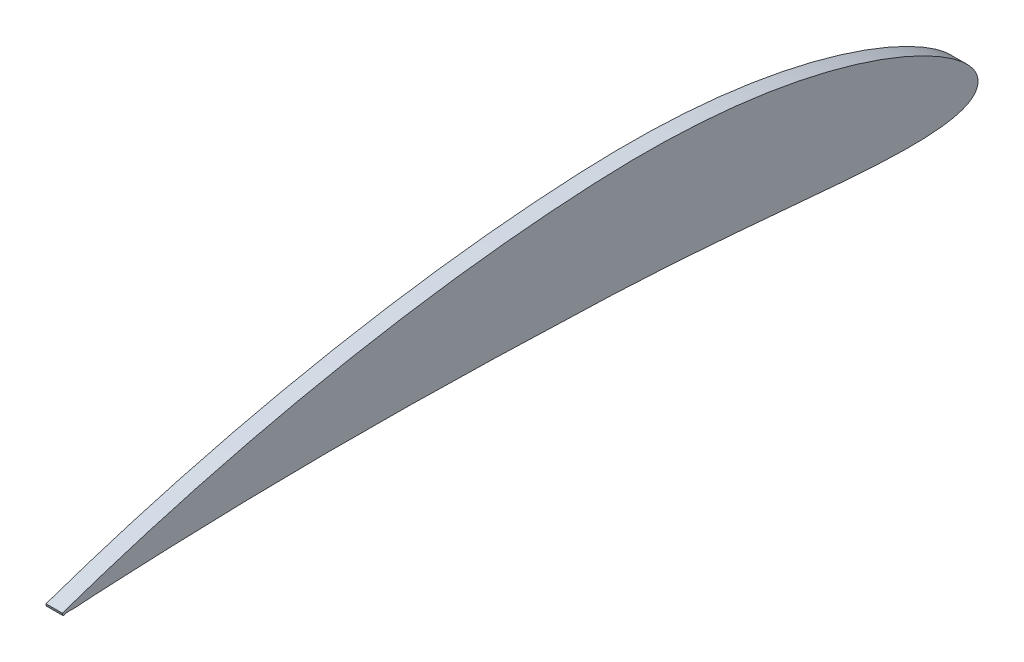
ISO-10303-21;
HEADER;
FILE_DESCRIPTION(('STEP AP214'),'2;1');
FILE_NAME('part.step','',(''),(''),'','','');
FILE_SCHEMA(('AUTOMOTIVE_DESIGN { 1 0 10303 214 1 1 1 1 }'));
ENDSEC;
DATA;
#1=APPLICATION_CONTEXT('core data for automotive mechanical design processes');
#2=APPLICATION_PROTOCOL_DEFINITION('international standard','automotive_design',2000,#1);
#3=PRODUCT_CONTEXT('',#1,'mechanical');
#4=PRODUCT('Part','Part','',(#3));
#5=PRODUCT_RELATED_PRODUCT_CATEGORY('part','',(#4));
#6=PRODUCT_DEFINITION_FORMATION('','',#4);
#7=PRODUCT_DEFINITION_CONTEXT('part definition',#1,'design');
#8=PRODUCT_DEFINITION('design','',#6,#7);
#9=PRODUCT_DEFINITION_SHAPE('','',#8);
#10=(LENGTH_UNIT() NAMED_UNIT(*) SI_UNIT(.MILLI.,.METRE.));
#11=(NAMED_UNIT(*) PLANE_ANGLE_UNIT() SI_UNIT($,.RADIAN.));
#12=(NAMED_UNIT(*) SI_UNIT($,.STERADIAN.) SOLID_ANGLE_UNIT());
#13=UNCERTAINTY_MEASURE_WITH_UNIT(LENGTH_MEASURE(1.E-05),#10,'distance_accuracy_value','');
#14=(GEOMETRIC_REPRESENTATION_CONTEXT(3) GLOBAL_UNCERTAINTY_ASSIGNED_CONTEXT((#13)) GLOBAL_UNIT_ASSIGNED_CONTEXT((#10,
#11,#12)) REPRESENTATION_CONTEXT('',''));
#15=CARTESIAN_POINT('',(0.,0.,0.));
#16=DIRECTION('',(0.,0.,1.));
#17=DIRECTION('',(1.,0.,0.));
#18=AXIS2_PLACEMENT_3D('',#15,#16,#17);
#19=CARTESIAN_POINT('',(-3.175,-0.0302571964763549,354.787327227915));
#20=CARTESIAN_POINT('',(-3.175,-0.202511549774369,354.777220058735));
#21=CARTESIAN_POINT('',(-3.175,-0.758116619532224,354.744619463571));
#22=CARTESIAN_POINT('',(-3.175,-0.0353878265544988,352.780150329408));
#23=CARTESIAN_POINT('',(-3.175,-0.406394891328532,350.227621537646));
#24=CARTESIAN_POINT('',(-3.175,0.191518705423128,345.076973542852));
#25=CARTESIAN_POINT('',(-3.175,0.426846954997304,338.388880463138));
#26=CARTESIAN_POINT('',(-3.175,0.912902226587254,329.767358245601));
#27=CARTESIAN_POINT('',(-3.175,1.37107480853054,319.513378005819));
#28=CARTESIAN_POINT('',(-3.175,1.85212662662604,307.681856469284));
#29=CARTESIAN_POINT('',(-3.175,2.2828903737653,294.437996631764));
#30=CARTESIAN_POINT('',(-3.175,2.65636592644588,279.933149694368));
#31=CARTESIAN_POINT('',(-3.175,2.90744759821903,264.337268620967));
#32=CARTESIAN_POINT('',(-3.175,3.02848065946825,247.830237404837));
#33=CARTESIAN_POINT('',(-3.175,2.97910623211237,224.541124113717));
#34=CARTESIAN_POINT('',(-3.175,2.58624656268472,200.671973719441));
#35=CARTESIAN_POINT('',(-3.175,1.91789319340299,176.483884619505));
#36=CARTESIAN_POINT('',(-3.175,1.28674404323604,158.296467958687));
#37=CARTESIAN_POINT('',(-3.175,0.674535202653767,140.48477689744));
#38=CARTESIAN_POINT('',(-3.175,-0.458414507964394,117.937239158073));
#39=CARTESIAN_POINT('',(-3.175,-2.15355585803942,96.4067365521407));
#40=CARTESIAN_POINT('',(-3.175,-3.98391169785236,75.9298626432168));
#41=CARTESIAN_POINT('',(-3.175,-5.23803481691952,61.9523939500743));
#42=CARTESIAN_POINT('',(-3.175,-6.3018667845873,49.0830780174977));
#43=CARTESIAN_POINT('',(-3.175,-7.05379709208437,37.4470572233417));
#44=CARTESIAN_POINT('',(-3.175,-7.40487495085787,27.1638266260831));
#45=CARTESIAN_POINT('',(-3.175,-7.26852765592077,18.3491197902741));
#46=CARTESIAN_POINT('',(-3.175,-6.58746462442697,11.0873159681167));
#47=CARTESIAN_POINT('',(-3.175,-5.28808573883758,5.4507808849597));
#48=CARTESIAN_POINT('',(-3.175,-3.30894318563573,1.35108725963543));
#49=CARTESIAN_POINT('',(-3.175,-0.148325215865237,-0.987487677240321));
#50=CARTESIAN_POINT('',(-3.175,3.7967578133831,-0.765838064798878));
#51=CARTESIAN_POINT('',(-3.175,7.71649979382027,1.67922407257184));
#52=CARTESIAN_POINT('',(-3.175,11.8553419578337,5.92689766090299));
#53=CARTESIAN_POINT('',(-3.175,16.2262899348965,12.1072031542234));
#54=CARTESIAN_POINT('',(-3.175,20.7343193498453,20.187014187513));
#55=CARTESIAN_POINT('',(-3.175,25.2201252971746,30.130463623116));
#56=CARTESIAN_POINT('',(-3.175,29.5108543834638,41.8433907768923));
#57=CARTESIAN_POINT('',(-3.175,33.4329059974258,55.1997604360673));
#58=CARTESIAN_POINT('',(-3.175,36.8104805743368,70.0434509571498));
#59=CARTESIAN_POINT('',(-3.175,39.4786761807971,86.1884085277303));
#60=CARTESIAN_POINT('',(-3.175,41.32105063238,103.42216726238));
#61=CARTESIAN_POINT('',(-3.175,42.2288581946823,121.516747473044));
#62=CARTESIAN_POINT('',(-3.175,42.1113766684293,140.09669102153));
#63=CARTESIAN_POINT('',(-3.175,41.1132128906756,158.902335219002));
#64=CARTESIAN_POINT('',(-3.175,39.0904540579609,183.961657870227));
#65=CARTESIAN_POINT('',(-3.175,36.0047557168601,208.774809212926));
#66=CARTESIAN_POINT('',(-3.175,31.1455287976255,238.622276389231));
#67=CARTESIAN_POINT('',(-3.175,26.6515697314507,261.175777938493));
#68=CARTESIAN_POINT('',(-3.175,21.7242725259394,282.422876263721));
#69=CARTESIAN_POINT('',(-3.175,17.1306006385399,300.598349456261));
#70=CARTESIAN_POINT('',(-3.175,11.7988919274353,319.654473711953));
#71=CARTESIAN_POINT('',(-3.175,6.72155114802005,336.024074691811));
#72=CARTESIAN_POINT('',(-3.175,3.49779827393597,345.800950265157));
#73=CARTESIAN_POINT('',(-3.175,1.92709586834348,350.478726649503));
#74=CARTESIAN_POINT('',(-3.175,0.953557869568799,353.29965963041));
#75=CARTESIAN_POINT('',(-3.175,0.519388000117919,354.559877308969));
#76=CARTESIAN_POINT('',(-3.175,0.410417886541196,354.876173010782));
#77=B_SPLINE_CURVE_WITH_KNOTS('',3,(#19,#20,#21,#22,#23,#24,#25,#26,#27,#28,#29,#30,#31,#32,#33,
#34,#35,#36,#37,#38,#39,#40,#41,#42,#43,#44,#45,#46,#47,#48,#49,#50,#51,#52,#53,#54,#55,#56,#57,
#58,#59,#60,#61,#62,#63,#64,#65,#66,#67,#68,#69,#70,#71,#72,#73,#74,#75,#76),.UNSPECIFIED.,.F.,
.F.,(4,1,1,1,1,1,1,1,1,1,1,1,1,1,1,1,1,1,1,1,1,1,1,1,1,1,1,1,1,1,1,1,1,1,1,1,1,1,1,1,1,1,1,1,1,
1,1,1,1,1,1,1,1,1,1,4),(0.,0.00061435602735338,0.00198160056276364,0.00606849911990259,
0.0128259983002053,0.0221600600259541,0.0339528411484215,0.0480573219049674,0.0643016527838605,
0.0824806064748046,0.102390013464696,0.123786894847983,0.146429707819126,0.170067604158041,
0.219268231220122,0.244299756437978,0.269272617042279,0.293879334559277,0.317367886846568,
0.361825599196296,0.382415541627446,0.401655123624231,0.419361860817184,0.435356743556399,
0.44945739068769,0.461534248286615,0.471483960270294,0.479298491667603,0.485175806315722,
0.489815015537041,0.49445371882196,0.500384211459872,0.508369297965653,0.518670584727767,
0.531320006060474,0.54625561026072,0.563345994084458,0.58242326585592,0.60328874622392,
0.625720296766354,0.649474912467889,0.674310012117921,0.699958821683972,0.725614899189679,
0.751503233324799,0.803021620411888,0.828087427427487,0.875472920842336,0.897280851310736,
0.917503738861992,0.952328750245583,0.978398030734231,0.987765198149775,0.994535224157492,
0.998628423374974,1.),.UNSPECIFIED.);
#78=DIRECTION('',(1.,0.,0.));
#79=VECTOR('',#78,1.);
#80=SURFACE_OF_LINEAR_EXTRUSION('',#77,#79);
#81=DIRECTION('',(1.,0.,0.));
#82=VECTOR('',#81,1.);
#83=CARTESIAN_POINT('',(-3.175,0.410417886541196,354.876173010782));
#84=LINE('',#83,#82);
#85=CARTESIAN_POINT('',(-3.175,0.410417886541196,354.876173010782));
#86=VERTEX_POINT('',#85);
#87=CARTESIAN_POINT('',(3.175,0.410417886541196,354.876173010782));
#88=VERTEX_POINT('',#87);
#89=EDGE_CURVE('E43',#86,#88,#84,.T.);
#90=ORIENTED_EDGE('',*,*,#89,.T.);
#91=CARTESIAN_POINT('',(3.175,-0.0302571964763549,354.787327227915));
#92=CARTESIAN_POINT('',(3.175,-0.202511549774369,354.777220058735));
#93=CARTESIAN_POINT('',(3.175,-0.758116619532224,354.744619463571));
#94=CARTESIAN_POINT('',(3.175,-0.0353878265544988,352.780150329408));
#95=CARTESIAN_POINT('',(3.175,-0.406394891328532,350.227621537646));
#96=CARTESIAN_POINT('',(3.175,0.191518705423128,345.076973542852));
#97=CARTESIAN_POINT('',(3.175,0.426846954997304,338.388880463138));
#98=CARTESIAN_POINT('',(3.175,0.912902226587254,329.767358245601));
#99=CARTESIAN_POINT('',(3.175,1.37107480853054,319.513378005819));
#100=CARTESIAN_POINT('',(3.175,1.85212662662604,307.681856469284));
#101=CARTESIAN_POINT('',(3.175,2.2828903737653,294.437996631764));
#102=CARTESIAN_POINT('',(3.175,2.65636592644588,279.933149694368));
#103=CARTESIAN_POINT('',(3.175,2.90744759821903,264.337268620967));
#104=CARTESIAN_POINT('',(3.175,3.02848065946825,247.830237404837));
#105=CARTESIAN_POINT('',(3.175,2.97910623211237,224.541124113717));
#106=CARTESIAN_POINT('',(3.175,2.58624656268472,200.671973719441));
#107=CARTESIAN_POINT('',(3.175,1.91789319340299,176.483884619505));
#108=CARTESIAN_POINT('',(3.175,1.28674404323604,158.296467958687));
#109=CARTESIAN_POINT('',(3.175,0.674535202653767,140.48477689744));
#110=CARTESIAN_POINT('',(3.175,-0.458414507964394,117.937239158073));
#111=CARTESIAN_POINT('',(3.175,-2.15355585803942,96.4067365521407));
#112=CARTESIAN_POINT('',(3.175,-3.98391169785236,75.9298626432168));
#113=CARTESIAN_POINT('',(3.175,-5.23803481691952,61.9523939500743));
#114=CARTESIAN_POINT('',(3.175,-6.3018667845873,49.0830780174977));
#115=CARTESIAN_POINT('',(3.175,-7.05379709208437,37.4470572233417));
#116=CARTESIAN_POINT('',(3.175,-7.40487495085787,27.1638266260831));
#117=CARTESIAN_POINT('',(3.175,-7.26852765592077,18.3491197902741));
#118=CARTESIAN_POINT('',(3.175,-6.58746462442697,11.0873159681167));
#119=CARTESIAN_POINT('',(3.175,-5.28808573883758,5.4507808849597));
#120=CARTESIAN_POINT('',(3.175,-3.30894318563573,1.35108725963543));
#121=CARTESIAN_POINT('',(3.175,-0.148325215865237,-0.987487677240321));
#122=CARTESIAN_POINT('',(3.175,3.7967578133831,-0.765838064798878));
#123=CARTESIAN_POINT('',(3.175,7.71649979382027,1.67922407257184));
#124=CARTESIAN_POINT('',(3.175,11.8553419578337,5.92689766090299));
#125=CARTESIAN_POINT('',(3.175,16.2262899348965,12.1072031542234));
#126=CARTESIAN_POINT('',(3.175,20.7343193498453,20.187014187513));
#127=CARTESIAN_POINT('',(3.175,25.2201252971746,30.130463623116));
#128=CARTESIAN_POINT('',(3.175,29.5108543834638,41.8433907768923));
#129=CARTESIAN_POINT('',(3.175,33.4329059974258,55.1997604360673));
#130=CARTESIAN_POINT('',(3.175,36.8104805743368,70.0434509571498));
#131=CARTESIAN_POINT('',(3.175,39.4786761807971,86.1884085277303));
#132=CARTESIAN_POINT('',(3.175,41.32105063238,103.42216726238));
#133=CARTESIAN_POINT('',(3.175,42.2288581946823,121.516747473044));
#134=CARTESIAN_POINT('',(3.175,42.1113766684293,140.09669102153));
#135=CARTESIAN_POINT('',(3.175,41.1132128906756,158.902335219002));
#136=CARTESIAN_POINT('',(3.175,39.0904540579609,183.961657870227));
#137=CARTESIAN_POINT('',(3.175,36.0047557168601,208.774809212926));
#138=CARTESIAN_POINT('',(3.175,31.1455287976255,238.622276389231));
#139=CARTESIAN_POINT('',(3.175,26.6515697314507,261.175777938493));
#140=CARTESIAN_POINT('',(3.175,21.7242725259394,282.422876263721));
#141=CARTESIAN_POINT('',(3.175,17.1306006385399,300.598349456261));
#142=CARTESIAN_POINT('',(3.175,11.7988919274353,319.654473711953));
#143=CARTESIAN_POINT('',(3.175,6.72155114802005,336.024074691811));
#144=CARTESIAN_POINT('',(3.175,3.49779827393597,345.800950265157));
#145=CARTESIAN_POINT('',(3.175,1.92709586834348,350.478726649503));
#146=CARTESIAN_POINT('',(3.175,0.953557869568799,353.29965963041));
#147=CARTESIAN_POINT('',(3.175,0.519388000117919,354.559877308969));
#148=CARTESIAN_POINT('',(3.175,0.410417886541196,354.876173010782));
#149=B_SPLINE_CURVE_WITH_KNOTS('',3,(#91,#92,#93,#94,#95,#96,#97,#98,#99,#100,#101,#102,#103,
#104,#105,#106,#107,#108,#109,#110,#111,#112,#113,#114,#115,#116,#117,#118,#119,#120,#121,#122,
#123,#124,#125,#126,#127,#128,#129,#130,#131,#132,#133,#134,#135,#136,#137,#138,#139,#140,#141,
#142,#143,#144,#145,#146,#147,#148),.UNSPECIFIED.,.F.,.F.,(4,1,1,1,1,1,1,1,1,1,1,1,1,1,1,1,1,1,
1,1,1,1,1,1,1,1,1,1,1,1,1,1,1,1,1,1,1,1,1,1,1,1,1,1,1,1,1,1,1,1,1,1,1,1,1,4),(0.,
0.00061435602735338,0.00198160056276364,0.00606849911990259,0.0128259983002053,
0.0221600600259541,0.0339528411484215,0.0480573219049674,0.0643016527838605,0.0824806064748046,
0.102390013464696,0.123786894847983,0.146429707819126,0.170067604158041,0.219268231220122,
0.244299756437978,0.269272617042279,0.293879334559277,0.317367886846568,0.361825599196296,
0.382415541627446,0.401655123624231,0.419361860817184,0.435356743556399,0.44945739068769,
0.461534248286615,0.471483960270294,0.479298491667603,0.485175806315722,0.489815015537041,
0.49445371882196,0.500384211459872,0.508369297965653,0.518670584727767,0.531320006060474,
0.54625561026072,0.563345994084458,0.58242326585592,0.60328874622392,0.625720296766354,
0.649474912467889,0.674310012117921,0.699958821683972,0.725614899189679,0.751503233324799,
0.803021620411888,0.828087427427487,0.875472920842336,0.897280851310736,0.917503738861992,
0.952328750245583,0.978398030734231,0.987765198149775,0.994535224157492,0.998628423374974,1.),.UNSPECIFIED.);
#150=CARTESIAN_POINT('',(3.175,-0.030257196476355,354.787327227915));
#151=VERTEX_POINT('',#150);
#152=EDGE_CURVE('E64',#151,#88,#149,.T.);
#153=ORIENTED_EDGE('',*,*,#152,.F.);
#154=DIRECTION('',(1.,0.,0.));
#155=VECTOR('',#154,1.);
#156=CARTESIAN_POINT('',(-3.175,-0.030257196476355,354.787327227915));
#157=LINE('',#156,#155);
#158=CARTESIAN_POINT('',(-3.175,-0.030257196476355,354.787327227915));
#159=VERTEX_POINT('',#158);
#160=EDGE_CURVE('E11',#159,#151,#157,.T.);
#161=ORIENTED_EDGE('',*,*,#160,.F.);
#162=EDGE_CURVE('E65',#159,#86,#77,.T.);
#163=ORIENTED_EDGE('',*,*,#162,.T.);
#164=EDGE_LOOP('',(#90,#153,#161,#163));
#165=FACE_BOUND('',#164,.T.);
#166=ADVANCED_FACE('F39',(#165),#80,.T.);
#167=CARTESIAN_POINT('',(-3.175,-0.030257196476355,354.787327227915));
#168=DIRECTION('',(0.,-0.197636177726589,0.980275441523261));
#169=DIRECTION('',(0.,-0.980275441523261,-0.197636177726589));
#170=AXIS2_PLACEMENT_3D('',#167,#168,#169);
#171=PLANE('',#170);
#172=ORIENTED_EDGE('',*,*,#160,.T.);
#173=DIRECTION('',(0.,-0.980275441523261,-0.197636177726589));
#174=VECTOR('',#173,1.);
#175=CARTESIAN_POINT('',(3.175,-0.030257196476355,354.787327227915));
#176=LINE('',#175,#174);
#177=EDGE_CURVE('E69',#88,#151,#176,.T.);
#178=ORIENTED_EDGE('',*,*,#177,.F.);
#179=ORIENTED_EDGE('',*,*,#89,.F.);
#180=DIRECTION('',(0.,-0.980275441523261,-0.197636177726589));
#181=VECTOR('',#180,1.);
#182=CARTESIAN_POINT('',(-3.175,-0.030257196476355,354.787327227915));
#183=LINE('',#182,#181);
#184=EDGE_CURVE('E67',#86,#159,#183,.T.);
#185=ORIENTED_EDGE('',*,*,#184,.T.);
#186=EDGE_LOOP('',(#172,#178,#179,#185));
#187=FACE_BOUND('',#186,.T.);
#188=ADVANCED_FACE('F70',(#187),#171,.T.);
#189=CARTESIAN_POINT('',(-3.175,6.95548452892668,1.34686834904547));
#190=DIRECTION('',(-1.,0.,0.));
#191=DIRECTION('',(0.,0.,1.));
#192=AXIS2_PLACEMENT_3D('',#189,#190,#191);
#193=PLANE('',#192);
#194=ORIENTED_EDGE('',*,*,#162,.F.);
#195=ORIENTED_EDGE('',*,*,#184,.F.);
#196=EDGE_LOOP('',(#194,#195));
#197=FACE_BOUND('',#196,.T.);
#198=ADVANCED_FACE('F88',(#197),#193,.T.);
#199=CARTESIAN_POINT('',(3.175,6.95548452892668,1.34686834904547));
#200=DIRECTION('',(-1.,0.,0.));
#201=DIRECTION('',(0.,0.,1.));
#202=AXIS2_PLACEMENT_3D('',#199,#200,#201);
#203=PLANE('',#202);
#204=ORIENTED_EDGE('',*,*,#152,.T.);
#205=ORIENTED_EDGE('',*,*,#177,.T.);
#206=EDGE_LOOP('',(#204,#205));
#207=FACE_BOUND('',#206,.T.);
#208=ADVANCED_FACE('F73',(#207),#203,.F.);
#209=CLOSED_SHELL('',(#166,#188,#198,#208));
#210=MANIFOLD_SOLID_BREP('B2',#209);
#211=ADVANCED_BREP_SHAPE_REPRESENTATION('',(#18,#210),#14);
#212=SHAPE_DEFINITION_REPRESENTATION(#9,#211);
ENDSEC;
END-ISO-10303-21;
